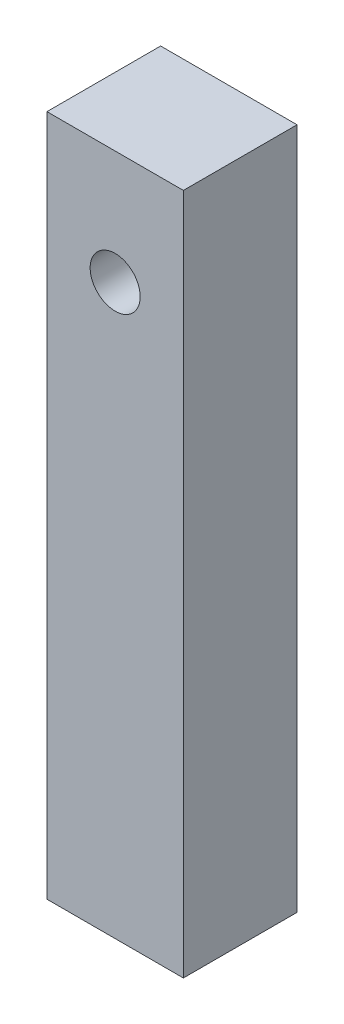
ISO-10303-21;
HEADER;
FILE_DESCRIPTION(('STEP AP214'),'2;1');
FILE_NAME('part.step','',(''),(''),'','','');
FILE_SCHEMA(('AUTOMOTIVE_DESIGN { 1 0 10303 214 1 1 1 1 }'));
ENDSEC;
DATA;
#1=APPLICATION_CONTEXT('core data for automotive mechanical design processes');
#2=APPLICATION_PROTOCOL_DEFINITION('international standard','automotive_design',2000,#1);
#3=PRODUCT_CONTEXT('',#1,'mechanical');
#4=PRODUCT('Part','Part','',(#3));
#5=PRODUCT_RELATED_PRODUCT_CATEGORY('part','',(#4));
#6=PRODUCT_DEFINITION_FORMATION('','',#4);
#7=PRODUCT_DEFINITION_CONTEXT('part definition',#1,'design');
#8=PRODUCT_DEFINITION('design','',#6,#7);
#9=PRODUCT_DEFINITION_SHAPE('','',#8);
#10=(LENGTH_UNIT() NAMED_UNIT(*) SI_UNIT(.MILLI.,.METRE.));
#11=(NAMED_UNIT(*) PLANE_ANGLE_UNIT() SI_UNIT($,.RADIAN.));
#12=(NAMED_UNIT(*) SI_UNIT($,.STERADIAN.) SOLID_ANGLE_UNIT());
#13=UNCERTAINTY_MEASURE_WITH_UNIT(LENGTH_MEASURE(1.E-05),#10,'distance_accuracy_value','');
#14=(GEOMETRIC_REPRESENTATION_CONTEXT(3) GLOBAL_UNCERTAINTY_ASSIGNED_CONTEXT((#13)) GLOBAL_UNIT_ASSIGNED_CONTEXT((#10,
#11,#12)) REPRESENTATION_CONTEXT('',''));
#15=CARTESIAN_POINT('',(0.,0.,0.));
#16=DIRECTION('',(0.,0.,1.));
#17=DIRECTION('',(1.,0.,0.));
#18=AXIS2_PLACEMENT_3D('',#15,#16,#17);
#19=CARTESIAN_POINT('',(-2.0454933601474,30.,0.521910465795825));
#20=DIRECTION('',(1.,0.,0.));
#21=DIRECTION('',(0.,0.,-1.));
#22=AXIS2_PLACEMENT_3D('',#19,#20,#21);
#23=PLANE('',#22);
#24=DIRECTION('',(0.,0.,1.));
#25=VECTOR('',#24,1.);
#26=CARTESIAN_POINT('',(-2.0454933601474,0.,0.521910465795825));
#27=LINE('',#26,#25);
#28=CARTESIAN_POINT('',(-2.0454933601474,0.,-4.47808953420417));
#29=VERTEX_POINT('',#28);
#30=CARTESIAN_POINT('',(-2.0454933601474,0.,0.521910465795825));
#31=VERTEX_POINT('',#30);
#32=EDGE_CURVE('E109',#29,#31,#27,.T.);
#33=ORIENTED_EDGE('',*,*,#32,.T.);
#34=DIRECTION('',(0.,-1.,0.));
#35=VECTOR('',#34,1.);
#36=CARTESIAN_POINT('',(-2.0454933601474,30.,0.521910465795825));
#37=LINE('',#36,#35);
#38=CARTESIAN_POINT('',(-2.0454933601474,30.,0.521910465795825));
#39=VERTEX_POINT('',#38);
#40=EDGE_CURVE('E11',#39,#31,#37,.T.);
#41=ORIENTED_EDGE('',*,*,#40,.F.);
#42=DIRECTION('',(0.,0.,1.));
#43=VECTOR('',#42,1.);
#44=CARTESIAN_POINT('',(-2.0454933601474,30.,0.521910465795825));
#45=LINE('',#44,#43);
#46=CARTESIAN_POINT('',(-2.0454933601474,30.,-4.47808953420417));
#47=VERTEX_POINT('',#46);
#48=EDGE_CURVE('E92',#47,#39,#45,.T.);
#49=ORIENTED_EDGE('',*,*,#48,.F.);
#50=DIRECTION('',(0.,-1.,0.));
#51=VECTOR('',#50,1.);
#52=CARTESIAN_POINT('',(-2.0454933601474,30.,-4.47808953420417));
#53=LINE('',#52,#51);
#54=EDGE_CURVE('E105',#47,#29,#53,.T.);
#55=ORIENTED_EDGE('',*,*,#54,.T.);
#56=EDGE_LOOP('',(#33,#41,#49,#55));
#57=FACE_BOUND('',#56,.T.);
#58=ADVANCED_FACE('F39',(#57),#23,.F.);
#59=CARTESIAN_POINT('',(3.9545066398526,30.,0.521910465795825));
#60=DIRECTION('',(0.,0.,-1.));
#61=DIRECTION('',(-1.,0.,0.));
#62=AXIS2_PLACEMENT_3D('',#59,#60,#61);
#63=PLANE('',#62);
#64=CARTESIAN_POINT('',(0.954506639852597,25.,0.521910465795825));
#65=DIRECTION('',(0.,0.,1.));
#66=DIRECTION('',(1.,0.,0.));
#67=AXIS2_PLACEMENT_3D('',#64,#65,#66);
#68=CIRCLE('',#67,1.1);
#69=CARTESIAN_POINT('',(2.0545066398526,25.,0.521910465795825));
#70=VERTEX_POINT('',#69);
#71=EDGE_CURVE('E129',#70,#70,#68,.T.);
#72=ORIENTED_EDGE('',*,*,#71,.F.);
#73=EDGE_LOOP('',(#72));
#74=FACE_BOUND('',#73,.T.);
#75=DIRECTION('',(1.,0.,0.));
#76=VECTOR('',#75,1.);
#77=CARTESIAN_POINT('',(3.9545066398526,0.,0.521910465795825));
#78=LINE('',#77,#76);
#79=CARTESIAN_POINT('',(3.9545066398526,0.,0.521910465795825));
#80=VERTEX_POINT('',#79);
#81=EDGE_CURVE('E97',#31,#80,#78,.T.);
#82=ORIENTED_EDGE('',*,*,#81,.T.);
#83=DIRECTION('',(0.,-1.,0.));
#84=VECTOR('',#83,1.);
#85=CARTESIAN_POINT('',(3.9545066398526,30.,0.521910465795825));
#86=LINE('',#85,#84);
#87=CARTESIAN_POINT('',(3.9545066398526,30.,0.521910465795825));
#88=VERTEX_POINT('',#87);
#89=EDGE_CURVE('E49',#88,#80,#86,.T.);
#90=ORIENTED_EDGE('',*,*,#89,.F.);
#91=DIRECTION('',(1.,0.,0.));
#92=VECTOR('',#91,1.);
#93=CARTESIAN_POINT('',(3.9545066398526,30.,0.521910465795825));
#94=LINE('',#93,#92);
#95=EDGE_CURVE('E87',#39,#88,#94,.T.);
#96=ORIENTED_EDGE('',*,*,#95,.F.);
#97=ORIENTED_EDGE('',*,*,#40,.T.);
#98=EDGE_LOOP('',(#82,#90,#96,#97));
#99=FACE_BOUND('',#98,.T.);
#100=ADVANCED_FACE('F96',(#74,#99),#63,.F.);
#101=CARTESIAN_POINT('',(3.9545066398526,30.,-4.47808953420417));
#102=DIRECTION('',(-1.,0.,0.));
#103=DIRECTION('',(0.,0.,1.));
#104=AXIS2_PLACEMENT_3D('',#101,#102,#103);
#105=PLANE('',#104);
#106=DIRECTION('',(0.,0.,-1.));
#107=VECTOR('',#106,1.);
#108=CARTESIAN_POINT('',(3.9545066398526,0.,-4.47808953420417));
#109=LINE('',#108,#107);
#110=CARTESIAN_POINT('',(3.9545066398526,0.,-4.47808953420417));
#111=VERTEX_POINT('',#110);
#112=EDGE_CURVE('E74',#80,#111,#109,.T.);
#113=ORIENTED_EDGE('',*,*,#112,.T.);
#114=DIRECTION('',(0.,-1.,0.));
#115=VECTOR('',#114,1.);
#116=CARTESIAN_POINT('',(3.9545066398526,30.,-4.47808953420417));
#117=LINE('',#116,#115);
#118=CARTESIAN_POINT('',(3.9545066398526,30.,-4.47808953420417));
#119=VERTEX_POINT('',#118);
#120=EDGE_CURVE('E99',#119,#111,#117,.T.);
#121=ORIENTED_EDGE('',*,*,#120,.F.);
#122=DIRECTION('',(0.,0.,-1.));
#123=VECTOR('',#122,1.);
#124=CARTESIAN_POINT('',(3.9545066398526,30.,-4.47808953420417));
#125=LINE('',#124,#123);
#126=EDGE_CURVE('E90',#88,#119,#125,.T.);
#127=ORIENTED_EDGE('',*,*,#126,.F.);
#128=ORIENTED_EDGE('',*,*,#89,.T.);
#129=EDGE_LOOP('',(#113,#121,#127,#128));
#130=FACE_BOUND('',#129,.T.);
#131=ADVANCED_FACE('F101',(#130),#105,.F.);
#132=CARTESIAN_POINT('',(-2.0454933601474,30.,-4.47808953420417));
#133=DIRECTION('',(0.,0.,1.));
#134=DIRECTION('',(1.,0.,0.));
#135=AXIS2_PLACEMENT_3D('',#132,#133,#134);
#136=PLANE('',#135);
#137=CARTESIAN_POINT('',(0.954506639852597,25.,-4.47808953420417));
#138=DIRECTION('',(0.,0.,1.));
#139=DIRECTION('',(1.,0.,0.));
#140=AXIS2_PLACEMENT_3D('',#137,#138,#139);
#141=CIRCLE('',#140,1.1);
#142=CARTESIAN_POINT('',(2.0545066398526,25.,-4.47808953420417));
#143=VERTEX_POINT('',#142);
#144=EDGE_CURVE('E42',#143,#143,#141,.T.);
#145=ORIENTED_EDGE('',*,*,#144,.T.);
#146=EDGE_LOOP('',(#145));
#147=FACE_BOUND('',#146,.T.);
#148=DIRECTION('',(-1.,0.,0.));
#149=VECTOR('',#148,1.);
#150=CARTESIAN_POINT('',(-2.0454933601474,0.,-4.47808953420417));
#151=LINE('',#150,#149);
#152=EDGE_CURVE('E80',#111,#29,#151,.T.);
#153=ORIENTED_EDGE('',*,*,#152,.T.);
#154=ORIENTED_EDGE('',*,*,#54,.F.);
#155=DIRECTION('',(-1.,0.,0.));
#156=VECTOR('',#155,1.);
#157=CARTESIAN_POINT('',(-2.0454933601474,30.,-4.47808953420417));
#158=LINE('',#157,#156);
#159=EDGE_CURVE('E57',#119,#47,#158,.T.);
#160=ORIENTED_EDGE('',*,*,#159,.F.);
#161=ORIENTED_EDGE('',*,*,#120,.T.);
#162=EDGE_LOOP('',(#153,#154,#160,#161));
#163=FACE_BOUND('',#162,.T.);
#164=ADVANCED_FACE('F122',(#147,#163),#136,.F.);
#165=CARTESIAN_POINT('',(0.,30.,0.));
#166=DIRECTION('',(0.,-1.,0.));
#167=DIRECTION('',(0.,0.,-1.));
#168=AXIS2_PLACEMENT_3D('',#165,#166,#167);
#169=PLANE('',#168);
#170=ORIENTED_EDGE('',*,*,#48,.T.);
#171=ORIENTED_EDGE('',*,*,#95,.T.);
#172=ORIENTED_EDGE('',*,*,#126,.T.);
#173=ORIENTED_EDGE('',*,*,#159,.T.);
#174=EDGE_LOOP('',(#170,#171,#172,#173));
#175=FACE_BOUND('',#174,.T.);
#176=ADVANCED_FACE('F88',(#175),#169,.F.);
#177=CARTESIAN_POINT('',(0.,0.,0.));
#178=DIRECTION('',(0.,-1.,0.));
#179=DIRECTION('',(0.,0.,-1.));
#180=AXIS2_PLACEMENT_3D('',#177,#178,#179);
#181=PLANE('',#180);
#182=ORIENTED_EDGE('',*,*,#32,.F.);
#183=ORIENTED_EDGE('',*,*,#152,.F.);
#184=ORIENTED_EDGE('',*,*,#112,.F.);
#185=ORIENTED_EDGE('',*,*,#81,.F.);
#186=EDGE_LOOP('',(#182,#183,#184,#185));
#187=FACE_BOUND('',#186,.T.);
#188=ADVANCED_FACE('F125',(#187),#181,.T.);
#189=CARTESIAN_POINT('',(0.954506639852597,25.,-19.4780895342042));
#190=DIRECTION('',(0.,0.,1.));
#191=DIRECTION('',(1.,0.,0.));
#192=AXIS2_PLACEMENT_3D('',#189,#190,#191);
#193=CYLINDRICAL_SURFACE('',#192,1.1);
#194=ORIENTED_EDGE('',*,*,#71,.T.);
#195=EDGE_LOOP('',(#194));
#196=FACE_BOUND('',#195,.T.);
#197=ORIENTED_EDGE('',*,*,#144,.F.);
#198=EDGE_LOOP('',(#197));
#199=FACE_BOUND('',#198,.T.);
#200=ADVANCED_FACE('F139',(#196,#199),#193,.F.);
#201=CLOSED_SHELL('',(#58,#100,#131,#164,#176,#188,#200));
#202=MANIFOLD_SOLID_BREP('B2',#201);
#203=ADVANCED_BREP_SHAPE_REPRESENTATION('',(#18,#202),#14);
#204=SHAPE_DEFINITION_REPRESENTATION(#9,#203);
ENDSEC;
END-ISO-10303-21;
